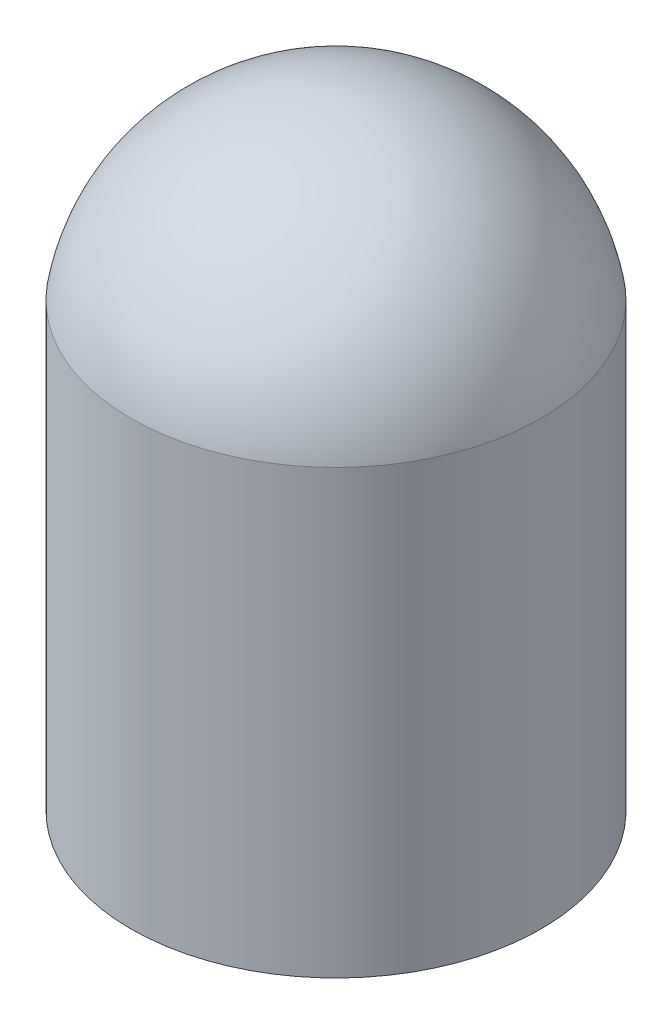
ISO-10303-21;
HEADER;
FILE_DESCRIPTION(('STEP AP214'),'2;1');
FILE_NAME('part.step','',(''),(''),'','','');
FILE_SCHEMA(('AUTOMOTIVE_DESIGN { 1 0 10303 214 1 1 1 1 }'));
ENDSEC;
DATA;
#1=APPLICATION_CONTEXT('core data for automotive mechanical design processes');
#2=APPLICATION_PROTOCOL_DEFINITION('international standard','automotive_design',2000,#1);
#3=PRODUCT_CONTEXT('',#1,'mechanical');
#4=PRODUCT('Part','Part','',(#3));
#5=PRODUCT_RELATED_PRODUCT_CATEGORY('part','',(#4));
#6=PRODUCT_DEFINITION_FORMATION('','',#4);
#7=PRODUCT_DEFINITION_CONTEXT('part definition',#1,'design');
#8=PRODUCT_DEFINITION('design','',#6,#7);
#9=PRODUCT_DEFINITION_SHAPE('','',#8);
#10=(LENGTH_UNIT() NAMED_UNIT(*) SI_UNIT(.MILLI.,.METRE.));
#11=(NAMED_UNIT(*) PLANE_ANGLE_UNIT() SI_UNIT($,.RADIAN.));
#12=(NAMED_UNIT(*) SI_UNIT($,.STERADIAN.) SOLID_ANGLE_UNIT());
#13=UNCERTAINTY_MEASURE_WITH_UNIT(LENGTH_MEASURE(1.E-05),#10,'distance_accuracy_value','');
#14=(GEOMETRIC_REPRESENTATION_CONTEXT(3) GLOBAL_UNCERTAINTY_ASSIGNED_CONTEXT((#13)) GLOBAL_UNIT_ASSIGNED_CONTEXT((#10,
#11,#12)) REPRESENTATION_CONTEXT('',''));
#15=CARTESIAN_POINT('',(0.,0.,0.));
#16=DIRECTION('',(0.,0.,1.));
#17=DIRECTION('',(1.,0.,0.));
#18=AXIS2_PLACEMENT_3D('',#15,#16,#17);
#19=CARTESIAN_POINT('',(0.,-26.4601684149444,83.0007381147452));
#20=DIRECTION('',(-1.,0.,0.));
#21=DIRECTION('',(0.,0.,-1.));
#22=AXIS2_PLACEMENT_3D('',#19,#20,#21);
#23=CIRCLE('',#22,5.06441949071016);
#24=TRIMMED_CURVE('',#23,(PARAMETER_VALUE(-1.57204287617818)),
(PARAMETER_VALUE(1.57204287617818)),.T.,.PARAMETER.);
#25=CARTESIAN_POINT('',(0.,-26.4601684149444,83.0070511621031));
#26=DIRECTION('',(0.,-1.,0.));
#27=AXIS1_PLACEMENT('',#25,#26);
#28=SURFACE_OF_REVOLUTION('',#24,#27);
#29=CARTESIAN_POINT('',(0.,-25.6157927652016,83.0070511621031));
#30=DIRECTION('',(0.,-1.,0.));
#31=DIRECTION('',(0.,0.,-1.));
#32=AXIS2_PLACEMENT_3D('',#29,#30,#31);
#33=CIRCLE('',#32,4.99984631950161);
#34=CARTESIAN_POINT('',(0.,-25.6157927652016,78.0072048426015));
#35=VERTEX_POINT('',#34);
#36=EDGE_CURVE('E39',#35,#35,#33,.T.);
#37=ORIENTED_EDGE('',*,*,#36,.F.);
#38=EDGE_LOOP('',(#37));
#39=FACE_BOUND('',#38,.T.);
#40=CARTESIAN_POINT('',(0.,-21.3957528589974,83.0070511621031));
#41=VERTEX_POINT('',#40);
#42=VERTEX_LOOP('',#41);
#43=FACE_BOUND('',#42,.T.);
#44=ADVANCED_FACE('F33',(#39,#43),#28,.T.);
#45=CARTESIAN_POINT('',(0.,-36.3957528589974,88.0068974816047));
#46=DIRECTION('',(0.,1.,0.));
#47=DIRECTION('',(0.,0.,1.));
#48=AXIS2_PLACEMENT_3D('',#45,#46,#47);
#49=PLANE('',#48);
#50=CARTESIAN_POINT('',(0.,-36.3957528589974,83.0070511621031));
#51=DIRECTION('',(0.,-1.,0.));
#52=DIRECTION('',(0.,0.,-1.));
#53=AXIS2_PLACEMENT_3D('',#50,#51,#52);
#54=CIRCLE('',#53,4.99984631950161);
#55=CARTESIAN_POINT('',(0.,-36.3957528589974,78.0072048426015));
#56=VERTEX_POINT('',#55);
#57=EDGE_CURVE('E11',#56,#56,#54,.T.);
#58=ORIENTED_EDGE('',*,*,#57,.T.);
#59=EDGE_LOOP('',(#58));
#60=FACE_BOUND('',#59,.T.);
#61=ADVANCED_FACE('F43',(#60),#49,.F.);
#62=CARTESIAN_POINT('',(0.,-36.3957528589974,83.0070511621031));
#63=DIRECTION('',(0.,-1.,0.));
#64=DIRECTION('',(0.,0.,-1.));
#65=AXIS2_PLACEMENT_3D('',#62,#63,#64);
#66=CYLINDRICAL_SURFACE('',#65,4.99984631950161);
#67=ORIENTED_EDGE('',*,*,#57,.F.);
#68=EDGE_LOOP('',(#67));
#69=FACE_BOUND('',#68,.T.);
#70=ORIENTED_EDGE('',*,*,#36,.T.);
#71=EDGE_LOOP('',(#70));
#72=FACE_BOUND('',#71,.T.);
#73=ADVANCED_FACE('F48',(#69,#72),#66,.T.);
#74=CLOSED_SHELL('',(#44,#61,#73));
#75=MANIFOLD_SOLID_BREP('B2',#74);
#76=ADVANCED_BREP_SHAPE_REPRESENTATION('',(#18,#75),#14);
#77=SHAPE_DEFINITION_REPRESENTATION(#9,#76);
ENDSEC;
END-ISO-10303-21;
